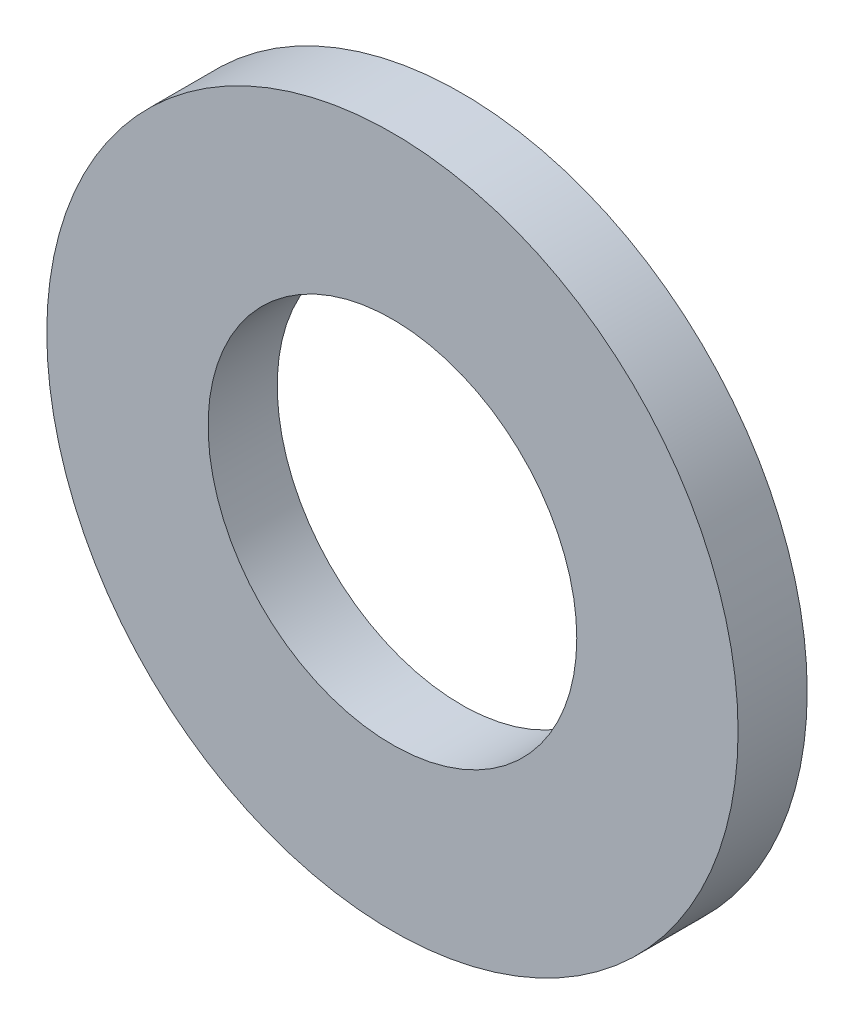
ISO-10303-21;
HEADER;
FILE_DESCRIPTION(('STEP AP214'),'2;1');
FILE_NAME('part.step','',(''),(''),'','','');
FILE_SCHEMA(('AUTOMOTIVE_DESIGN { 1 0 10303 214 1 1 1 1 }'));
ENDSEC;
DATA;
#1=APPLICATION_CONTEXT('core data for automotive mechanical design processes');
#2=APPLICATION_PROTOCOL_DEFINITION('international standard','automotive_design',2000,#1);
#3=PRODUCT_CONTEXT('',#1,'mechanical');
#4=PRODUCT('Part','Part','',(#3));
#5=PRODUCT_RELATED_PRODUCT_CATEGORY('part','',(#4));
#6=PRODUCT_DEFINITION_FORMATION('','',#4);
#7=PRODUCT_DEFINITION_CONTEXT('part definition',#1,'design');
#8=PRODUCT_DEFINITION('design','',#6,#7);
#9=PRODUCT_DEFINITION_SHAPE('','',#8);
#10=(LENGTH_UNIT() NAMED_UNIT(*) SI_UNIT(.MILLI.,.METRE.));
#11=(NAMED_UNIT(*) PLANE_ANGLE_UNIT() SI_UNIT($,.RADIAN.));
#12=(NAMED_UNIT(*) SI_UNIT($,.STERADIAN.) SOLID_ANGLE_UNIT());
#13=UNCERTAINTY_MEASURE_WITH_UNIT(LENGTH_MEASURE(1.E-05),#10,'distance_accuracy_value','');
#14=(GEOMETRIC_REPRESENTATION_CONTEXT(3) GLOBAL_UNCERTAINTY_ASSIGNED_CONTEXT((#13)) GLOBAL_UNIT_ASSIGNED_CONTEXT((#10,
#11,#12)) REPRESENTATION_CONTEXT('',''));
#15=CARTESIAN_POINT('',(0.,0.,0.));
#16=DIRECTION('',(0.,0.,1.));
#17=DIRECTION('',(1.,0.,0.));
#18=AXIS2_PLACEMENT_3D('',#15,#16,#17);
#19=CARTESIAN_POINT('',(0.,0.,1.2));
#20=DIRECTION('',(0.,0.,1.));
#21=DIRECTION('',(1.,0.,0.));
#22=AXIS2_PLACEMENT_3D('',#19,#20,#21);
#23=PLANE('',#22);
#24=CARTESIAN_POINT('',(0.,0.,1.2));
#25=DIRECTION('',(0.,0.,1.));
#26=DIRECTION('',(1.,0.,0.));
#27=AXIS2_PLACEMENT_3D('',#24,#25,#26);
#28=CIRCLE('',#27,6.);
#29=CARTESIAN_POINT('',(6.,0.,1.2));
#30=VERTEX_POINT('',#29);
#31=EDGE_CURVE('E10',#30,#30,#28,.T.);
#32=ORIENTED_EDGE('',*,*,#31,.T.);
#33=EDGE_LOOP('',(#32));
#34=FACE_BOUND('',#33,.T.);
#35=CARTESIAN_POINT('',(0.,0.,1.2));
#36=DIRECTION('',(0.,0.,1.));
#37=DIRECTION('',(1.,0.,0.));
#38=AXIS2_PLACEMENT_3D('',#35,#36,#37);
#39=CIRCLE('',#38,3.2);
#40=CARTESIAN_POINT('',(3.2,0.,1.2));
#41=VERTEX_POINT('',#40);
#42=EDGE_CURVE('E41',#41,#41,#39,.T.);
#43=ORIENTED_EDGE('',*,*,#42,.F.);
#44=EDGE_LOOP('',(#43));
#45=FACE_BOUND('',#44,.T.);
#46=ADVANCED_FACE('F30',(#34,#45),#23,.T.);
#47=CARTESIAN_POINT('',(0.,0.,0.));
#48=DIRECTION('',(0.,0.,1.));
#49=DIRECTION('',(1.,0.,0.));
#50=AXIS2_PLACEMENT_3D('',#47,#48,#49);
#51=PLANE('',#50);
#52=CARTESIAN_POINT('',(0.,0.,0.));
#53=DIRECTION('',(0.,0.,1.));
#54=DIRECTION('',(1.,0.,0.));
#55=AXIS2_PLACEMENT_3D('',#52,#53,#54);
#56=CIRCLE('',#55,6.);
#57=CARTESIAN_POINT('',(6.,0.,0.));
#58=VERTEX_POINT('',#57);
#59=EDGE_CURVE('E34',#58,#58,#56,.T.);
#60=ORIENTED_EDGE('',*,*,#59,.F.);
#61=EDGE_LOOP('',(#60));
#62=FACE_BOUND('',#61,.T.);
#63=CARTESIAN_POINT('',(0.,0.,0.));
#64=DIRECTION('',(0.,0.,1.));
#65=DIRECTION('',(1.,0.,0.));
#66=AXIS2_PLACEMENT_3D('',#63,#64,#65);
#67=CIRCLE('',#66,3.2);
#68=CARTESIAN_POINT('',(3.2,0.,0.));
#69=VERTEX_POINT('',#68);
#70=EDGE_CURVE('E43',#69,#69,#67,.T.);
#71=ORIENTED_EDGE('',*,*,#70,.T.);
#72=EDGE_LOOP('',(#71));
#73=FACE_BOUND('',#72,.T.);
#74=ADVANCED_FACE('F53',(#62,#73),#51,.F.);
#75=CARTESIAN_POINT('',(0.,0.,1.2));
#76=DIRECTION('',(0.,0.,-1.));
#77=DIRECTION('',(-1.,0.,0.));
#78=AXIS2_PLACEMENT_3D('',#75,#76,#77);
#79=CYLINDRICAL_SURFACE('',#78,6.);
#80=ORIENTED_EDGE('',*,*,#31,.F.);
#81=EDGE_LOOP('',(#80));
#82=FACE_BOUND('',#81,.T.);
#83=ORIENTED_EDGE('',*,*,#59,.T.);
#84=EDGE_LOOP('',(#83));
#85=FACE_BOUND('',#84,.T.);
#86=ADVANCED_FACE('F32',(#82,#85),#79,.T.);
#87=CARTESIAN_POINT('',(0.,0.,1.2));
#88=DIRECTION('',(0.,0.,-1.));
#89=DIRECTION('',(-1.,0.,0.));
#90=AXIS2_PLACEMENT_3D('',#87,#88,#89);
#91=CYLINDRICAL_SURFACE('',#90,3.2);
#92=ORIENTED_EDGE('',*,*,#42,.T.);
#93=EDGE_LOOP('',(#92));
#94=FACE_BOUND('',#93,.T.);
#95=ORIENTED_EDGE('',*,*,#70,.F.);
#96=EDGE_LOOP('',(#95));
#97=FACE_BOUND('',#96,.T.);
#98=ADVANCED_FACE('F49',(#94,#97),#91,.F.);
#99=CLOSED_SHELL('',(#46,#74,#86,#98));
#100=MANIFOLD_SOLID_BREP('B2',#99);
#101=ADVANCED_BREP_SHAPE_REPRESENTATION('',(#18,#100),#14);
#102=SHAPE_DEFINITION_REPRESENTATION(#9,#101);
ENDSEC;
END-ISO-10303-21;
